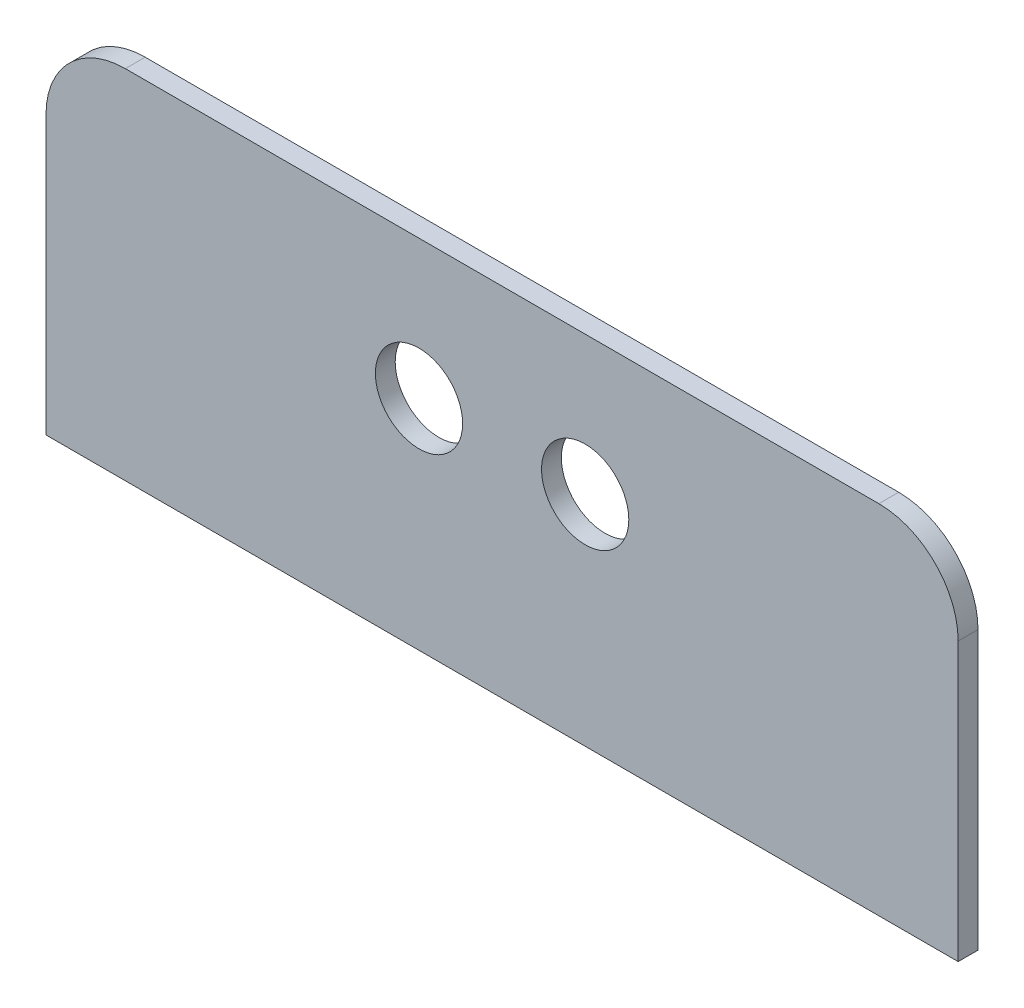
ISO-10303-21;
HEADER;
FILE_DESCRIPTION(('STEP AP214'),'2;1');
FILE_NAME('part.step','',(''),(''),'','','');
FILE_SCHEMA(('AUTOMOTIVE_DESIGN { 1 0 10303 214 1 1 1 1 }'));
ENDSEC;
DATA;
#1=APPLICATION_CONTEXT('core data for automotive mechanical design processes');
#2=APPLICATION_PROTOCOL_DEFINITION('international standard','automotive_design',2000,#1);
#3=PRODUCT_CONTEXT('',#1,'mechanical');
#4=PRODUCT('Part','Part','',(#3));
#5=PRODUCT_RELATED_PRODUCT_CATEGORY('part','',(#4));
#6=PRODUCT_DEFINITION_FORMATION('','',#4);
#7=PRODUCT_DEFINITION_CONTEXT('part definition',#1,'design');
#8=PRODUCT_DEFINITION('design','',#6,#7);
#9=PRODUCT_DEFINITION_SHAPE('','',#8);
#10=(LENGTH_UNIT() NAMED_UNIT(*) SI_UNIT(.MILLI.,.METRE.));
#11=(NAMED_UNIT(*) PLANE_ANGLE_UNIT() SI_UNIT($,.RADIAN.));
#12=(NAMED_UNIT(*) SI_UNIT($,.STERADIAN.) SOLID_ANGLE_UNIT());
#13=UNCERTAINTY_MEASURE_WITH_UNIT(LENGTH_MEASURE(1.E-05),#10,'distance_accuracy_value','');
#14=(GEOMETRIC_REPRESENTATION_CONTEXT(3) GLOBAL_UNCERTAINTY_ASSIGNED_CONTEXT((#13)) GLOBAL_UNIT_ASSIGNED_CONTEXT((#10,
#11,#12)) REPRESENTATION_CONTEXT('',''));
#15=CARTESIAN_POINT('',(0.,0.,0.));
#16=DIRECTION('',(0.,0.,1.));
#17=DIRECTION('',(1.,0.,0.));
#18=AXIS2_PLACEMENT_3D('',#15,#16,#17);
#19=CARTESIAN_POINT('',(115.,-45.,5.));
#20=DIRECTION('',(-1.,0.,0.));
#21=DIRECTION('',(0.,0.,1.));
#22=AXIS2_PLACEMENT_3D('',#19,#20,#21);
#23=PLANE('',#22);
#24=DIRECTION('',(0.,1.,0.));
#25=VECTOR('',#24,1.);
#26=CARTESIAN_POINT('',(115.,-45.,0.));
#27=LINE('',#26,#25);
#28=CARTESIAN_POINT('',(115.,-45.,0.));
#29=VERTEX_POINT('',#28);
#30=CARTESIAN_POINT('',(115.,25.,0.));
#31=VERTEX_POINT('',#30);
#32=EDGE_CURVE('E123',#29,#31,#27,.T.);
#33=ORIENTED_EDGE('',*,*,#32,.T.);
#34=DIRECTION('',(0.,0.,-1.));
#35=VECTOR('',#34,1.);
#36=CARTESIAN_POINT('',(115.,25.,5.));
#37=LINE('',#36,#35);
#38=CARTESIAN_POINT('',(115.,25.,5.));
#39=VERTEX_POINT('',#38);
#40=EDGE_CURVE('E63',#31,#39,#37,.F.);
#41=ORIENTED_EDGE('',*,*,#40,.T.);
#42=DIRECTION('',(0.,1.,0.));
#43=VECTOR('',#42,1.);
#44=CARTESIAN_POINT('',(115.,-45.,5.));
#45=LINE('',#44,#43);
#46=CARTESIAN_POINT('',(115.,-45.,5.));
#47=VERTEX_POINT('',#46);
#48=EDGE_CURVE('E135',#47,#39,#45,.T.);
#49=ORIENTED_EDGE('',*,*,#48,.F.);
#50=DIRECTION('',(0.,0.,-1.));
#51=VECTOR('',#50,1.);
#52=CARTESIAN_POINT('',(115.,-45.,5.));
#53=LINE('',#52,#51);
#54=EDGE_CURVE('E113',#47,#29,#53,.T.);
#55=ORIENTED_EDGE('',*,*,#54,.T.);
#56=EDGE_LOOP('',(#33,#41,#49,#55));
#57=FACE_BOUND('',#56,.T.);
#58=ADVANCED_FACE('F39',(#57),#23,.F.);
#59=CARTESIAN_POINT('',(-115.,45.,5.));
#60=DIRECTION('',(0.,-1.,0.));
#61=DIRECTION('',(0.,0.,-1.));
#62=AXIS2_PLACEMENT_3D('',#59,#60,#61);
#63=PLANE('',#62);
#64=DIRECTION('',(-1.,0.,0.));
#65=VECTOR('',#64,1.);
#66=CARTESIAN_POINT('',(-115.,45.,5.));
#67=LINE('',#66,#65);
#68=CARTESIAN_POINT('',(95.,45.,5.));
#69=VERTEX_POINT('',#68);
#70=CARTESIAN_POINT('',(-95.,45.,5.));
#71=VERTEX_POINT('',#70);
#72=EDGE_CURVE('E102',#69,#71,#67,.T.);
#73=ORIENTED_EDGE('',*,*,#72,.F.);
#74=DIRECTION('',(0.,0.,-1.));
#75=VECTOR('',#74,1.);
#76=CARTESIAN_POINT('',(95.,45.,5.));
#77=LINE('',#76,#75);
#78=CARTESIAN_POINT('',(95.,45.,0.));
#79=VERTEX_POINT('',#78);
#80=EDGE_CURVE('E139',#69,#79,#77,.T.);
#81=ORIENTED_EDGE('',*,*,#80,.T.);
#82=DIRECTION('',(-1.,0.,0.));
#83=VECTOR('',#82,1.);
#84=CARTESIAN_POINT('',(-115.,45.,0.));
#85=LINE('',#84,#83);
#86=CARTESIAN_POINT('',(-95.,45.,0.));
#87=VERTEX_POINT('',#86);
#88=EDGE_CURVE('E126',#79,#87,#85,.T.);
#89=ORIENTED_EDGE('',*,*,#88,.T.);
#90=DIRECTION('',(0.,0.,-1.));
#91=VECTOR('',#90,1.);
#92=CARTESIAN_POINT('',(-95.,45.,5.));
#93=LINE('',#92,#91);
#94=EDGE_CURVE('E112',#87,#71,#93,.F.);
#95=ORIENTED_EDGE('',*,*,#94,.T.);
#96=EDGE_LOOP('',(#73,#81,#89,#95));
#97=FACE_BOUND('',#96,.T.);
#98=ADVANCED_FACE('F158',(#97),#63,.F.);
#99=CARTESIAN_POINT('',(-115.,-45.,5.));
#100=DIRECTION('',(1.,0.,0.));
#101=DIRECTION('',(0.,0.,-1.));
#102=AXIS2_PLACEMENT_3D('',#99,#100,#101);
#103=PLANE('',#102);
#104=DIRECTION('',(0.,-1.,0.));
#105=VECTOR('',#104,1.);
#106=CARTESIAN_POINT('',(-115.,-45.,5.));
#107=LINE('',#106,#105);
#108=CARTESIAN_POINT('',(-115.,25.,5.));
#109=VERTEX_POINT('',#108);
#110=CARTESIAN_POINT('',(-115.,-45.,5.));
#111=VERTEX_POINT('',#110);
#112=EDGE_CURVE('E93',#109,#111,#107,.T.);
#113=ORIENTED_EDGE('',*,*,#112,.F.);
#114=DIRECTION('',(0.,0.,-1.));
#115=VECTOR('',#114,1.);
#116=CARTESIAN_POINT('',(-115.,25.,5.));
#117=LINE('',#116,#115);
#118=CARTESIAN_POINT('',(-115.,25.,0.));
#119=VERTEX_POINT('',#118);
#120=EDGE_CURVE('E11',#109,#119,#117,.T.);
#121=ORIENTED_EDGE('',*,*,#120,.T.);
#122=DIRECTION('',(0.,-1.,0.));
#123=VECTOR('',#122,1.);
#124=CARTESIAN_POINT('',(-115.,-45.,0.));
#125=LINE('',#124,#123);
#126=CARTESIAN_POINT('',(-115.,-45.,0.));
#127=VERTEX_POINT('',#126);
#128=EDGE_CURVE('E108',#119,#127,#125,.T.);
#129=ORIENTED_EDGE('',*,*,#128,.T.);
#130=DIRECTION('',(0.,0.,-1.));
#131=VECTOR('',#130,1.);
#132=CARTESIAN_POINT('',(-115.,-45.,5.));
#133=LINE('',#132,#131);
#134=EDGE_CURVE('E105',#111,#127,#133,.T.);
#135=ORIENTED_EDGE('',*,*,#134,.F.);
#136=EDGE_LOOP('',(#113,#121,#129,#135));
#137=FACE_BOUND('',#136,.T.);
#138=ADVANCED_FACE('F106',(#137),#103,.F.);
#139=CARTESIAN_POINT('',(-115.,-45.,5.));
#140=DIRECTION('',(0.,1.,0.));
#141=DIRECTION('',(0.,0.,1.));
#142=AXIS2_PLACEMENT_3D('',#139,#140,#141);
#143=PLANE('',#142);
#144=DIRECTION('',(1.,0.,0.));
#145=VECTOR('',#144,1.);
#146=CARTESIAN_POINT('',(-115.,-45.,0.));
#147=LINE('',#146,#145);
#148=EDGE_CURVE('E133',#127,#29,#147,.T.);
#149=ORIENTED_EDGE('',*,*,#148,.T.);
#150=ORIENTED_EDGE('',*,*,#54,.F.);
#151=DIRECTION('',(1.,0.,0.));
#152=VECTOR('',#151,1.);
#153=CARTESIAN_POINT('',(-115.,-45.,5.));
#154=LINE('',#153,#152);
#155=EDGE_CURVE('E97',#111,#47,#154,.T.);
#156=ORIENTED_EDGE('',*,*,#155,.F.);
#157=ORIENTED_EDGE('',*,*,#134,.T.);
#158=EDGE_LOOP('',(#149,#150,#156,#157));
#159=FACE_BOUND('',#158,.T.);
#160=ADVANCED_FACE('F115',(#159),#143,.F.);
#161=CARTESIAN_POINT('',(0.,0.,5.));
#162=DIRECTION('',(0.,0.,-1.));
#163=DIRECTION('',(-1.,0.,0.));
#164=AXIS2_PLACEMENT_3D('',#161,#162,#163);
#165=PLANE('',#164);
#166=CARTESIAN_POINT('',(-20.95,10.,5.));
#167=DIRECTION('',(0.,0.,1.));
#168=DIRECTION('',(1.,0.,0.));
#169=AXIS2_PLACEMENT_3D('',#166,#167,#168);
#170=CIRCLE('',#169,11.);
#171=CARTESIAN_POINT('',(-9.95,10.,5.));
#172=VERTEX_POINT('',#171);
#173=EDGE_CURVE('E127',#172,#172,#170,.T.);
#174=ORIENTED_EDGE('',*,*,#173,.F.);
#175=EDGE_LOOP('',(#174));
#176=FACE_BOUND('',#175,.T.);
#177=CARTESIAN_POINT('',(20.95,10.,5.));
#178=DIRECTION('',(0.,0.,1.));
#179=DIRECTION('',(1.,0.,0.));
#180=AXIS2_PLACEMENT_3D('',#177,#178,#179);
#181=CIRCLE('',#180,11.);
#182=CARTESIAN_POINT('',(31.95,10.,5.));
#183=VERTEX_POINT('',#182);
#184=EDGE_CURVE('E173',#183,#183,#181,.T.);
#185=ORIENTED_EDGE('',*,*,#184,.F.);
#186=EDGE_LOOP('',(#185));
#187=FACE_BOUND('',#186,.T.);
#188=ORIENTED_EDGE('',*,*,#48,.T.);
#189=CARTESIAN_POINT('',(95.,25.,5.));
#190=DIRECTION('',(0.,0.,-1.));
#191=DIRECTION('',(-1.,0.,0.));
#192=AXIS2_PLACEMENT_3D('',#189,#190,#191);
#193=CIRCLE('',#192,20.);
#194=EDGE_CURVE('E48',#39,#69,#193,.F.);
#195=ORIENTED_EDGE('',*,*,#194,.T.);
#196=ORIENTED_EDGE('',*,*,#72,.T.);
#197=CARTESIAN_POINT('',(-95.,25.,5.));
#198=DIRECTION('',(0.,0.,-1.));
#199=DIRECTION('',(-1.,0.,0.));
#200=AXIS2_PLACEMENT_3D('',#197,#198,#199);
#201=CIRCLE('',#200,20.);
#202=EDGE_CURVE('E55',#71,#109,#201,.F.);
#203=ORIENTED_EDGE('',*,*,#202,.T.);
#204=ORIENTED_EDGE('',*,*,#112,.T.);
#205=ORIENTED_EDGE('',*,*,#155,.T.);
#206=EDGE_LOOP('',(#188,#195,#196,#203,#204,#205));
#207=FACE_BOUND('',#206,.T.);
#208=ADVANCED_FACE('F95',(#176,#187,#207),#165,.F.);
#209=CARTESIAN_POINT('',(0.,0.,0.));
#210=DIRECTION('',(0.,0.,-1.));
#211=DIRECTION('',(-1.,0.,0.));
#212=AXIS2_PLACEMENT_3D('',#209,#210,#211);
#213=PLANE('',#212);
#214=CARTESIAN_POINT('',(-20.95,10.,0.));
#215=DIRECTION('',(0.,0.,-1.));
#216=DIRECTION('',(-1.,0.,0.));
#217=AXIS2_PLACEMENT_3D('',#214,#215,#216);
#218=CIRCLE('',#217,11.);
#219=CARTESIAN_POINT('',(-31.95,10.,0.));
#220=VERTEX_POINT('',#219);
#221=EDGE_CURVE('E177',#220,#220,#218,.F.);
#222=ORIENTED_EDGE('',*,*,#221,.T.);
#223=EDGE_LOOP('',(#222));
#224=FACE_BOUND('',#223,.T.);
#225=CARTESIAN_POINT('',(20.95,10.,0.));
#226=DIRECTION('',(0.,0.,-1.));
#227=DIRECTION('',(-1.,0.,0.));
#228=AXIS2_PLACEMENT_3D('',#225,#226,#227);
#229=CIRCLE('',#228,11.);
#230=CARTESIAN_POINT('',(9.95,10.,0.));
#231=VERTEX_POINT('',#230);
#232=EDGE_CURVE('E169',#231,#231,#229,.F.);
#233=ORIENTED_EDGE('',*,*,#232,.T.);
#234=EDGE_LOOP('',(#233));
#235=FACE_BOUND('',#234,.T.);
#236=ORIENTED_EDGE('',*,*,#88,.F.);
#237=CARTESIAN_POINT('',(95.,25.,0.));
#238=DIRECTION('',(0.,0.,-1.));
#239=DIRECTION('',(-1.,0.,0.));
#240=AXIS2_PLACEMENT_3D('',#237,#238,#239);
#241=CIRCLE('',#240,20.);
#242=EDGE_CURVE('E146',#79,#31,#241,.T.);
#243=ORIENTED_EDGE('',*,*,#242,.T.);
#244=ORIENTED_EDGE('',*,*,#32,.F.);
#245=ORIENTED_EDGE('',*,*,#148,.F.);
#246=ORIENTED_EDGE('',*,*,#128,.F.);
#247=CARTESIAN_POINT('',(-95.,25.,0.));
#248=DIRECTION('',(0.,0.,-1.));
#249=DIRECTION('',(-1.,0.,0.));
#250=AXIS2_PLACEMENT_3D('',#247,#248,#249);
#251=CIRCLE('',#250,20.);
#252=EDGE_CURVE('E143',#119,#87,#251,.T.);
#253=ORIENTED_EDGE('',*,*,#252,.T.);
#254=EDGE_LOOP('',(#236,#243,#244,#245,#246,#253));
#255=FACE_BOUND('',#254,.T.);
#256=ADVANCED_FACE('F165',(#224,#235,#255),#213,.T.);
#257=CARTESIAN_POINT('',(95.,25.,5.));
#258=DIRECTION('',(0.,0.,-1.));
#259=DIRECTION('',(-1.,0.,0.));
#260=AXIS2_PLACEMENT_3D('',#257,#258,#259);
#261=CYLINDRICAL_SURFACE('',#260,20.);
#262=ORIENTED_EDGE('',*,*,#194,.F.);
#263=ORIENTED_EDGE('',*,*,#40,.F.);
#264=ORIENTED_EDGE('',*,*,#242,.F.);
#265=ORIENTED_EDGE('',*,*,#80,.F.);
#266=EDGE_LOOP('',(#262,#263,#264,#265));
#267=FACE_BOUND('',#266,.T.);
#268=ADVANCED_FACE('F162',(#267),#261,.T.);
#269=CARTESIAN_POINT('',(-95.,25.,5.));
#270=DIRECTION('',(0.,0.,-1.));
#271=DIRECTION('',(-1.,0.,0.));
#272=AXIS2_PLACEMENT_3D('',#269,#270,#271);
#273=CYLINDRICAL_SURFACE('',#272,20.);
#274=ORIENTED_EDGE('',*,*,#202,.F.);
#275=ORIENTED_EDGE('',*,*,#94,.F.);
#276=ORIENTED_EDGE('',*,*,#252,.F.);
#277=ORIENTED_EDGE('',*,*,#120,.F.);
#278=EDGE_LOOP('',(#274,#275,#276,#277));
#279=FACE_BOUND('',#278,.T.);
#280=ADVANCED_FACE('F41',(#279),#273,.T.);
#281=CARTESIAN_POINT('',(20.95,10.,-0.00100000000000013));
#282=DIRECTION('',(0.,0.,1.));
#283=DIRECTION('',(1.,0.,0.));
#284=AXIS2_PLACEMENT_3D('',#281,#282,#283);
#285=CYLINDRICAL_SURFACE('',#284,11.);
#286=ORIENTED_EDGE('',*,*,#232,.F.);
#287=EDGE_LOOP('',(#286));
#288=FACE_BOUND('',#287,.T.);
#289=ORIENTED_EDGE('',*,*,#184,.T.);
#290=EDGE_LOOP('',(#289));
#291=FACE_BOUND('',#290,.T.);
#292=ADVANCED_FACE('F192',(#288,#291),#285,.F.);
#293=CARTESIAN_POINT('',(-20.95,10.,-0.00100000000000013));
#294=DIRECTION('',(0.,0.,1.));
#295=DIRECTION('',(1.,0.,0.));
#296=AXIS2_PLACEMENT_3D('',#293,#294,#295);
#297=CYLINDRICAL_SURFACE('',#296,11.);
#298=ORIENTED_EDGE('',*,*,#221,.F.);
#299=EDGE_LOOP('',(#298));
#300=FACE_BOUND('',#299,.T.);
#301=ORIENTED_EDGE('',*,*,#173,.T.);
#302=EDGE_LOOP('',(#301));
#303=FACE_BOUND('',#302,.T.);
#304=ADVANCED_FACE('F185',(#300,#303),#297,.F.);
#305=CLOSED_SHELL('',(#58,#98,#138,#160,#208,#256,#268,#280,#292,#304));
#306=MANIFOLD_SOLID_BREP('B2',#305);
#307=ADVANCED_BREP_SHAPE_REPRESENTATION('',(#18,#306),#14);
#308=SHAPE_DEFINITION_REPRESENTATION(#9,#307);
ENDSEC;
END-ISO-10303-21;
